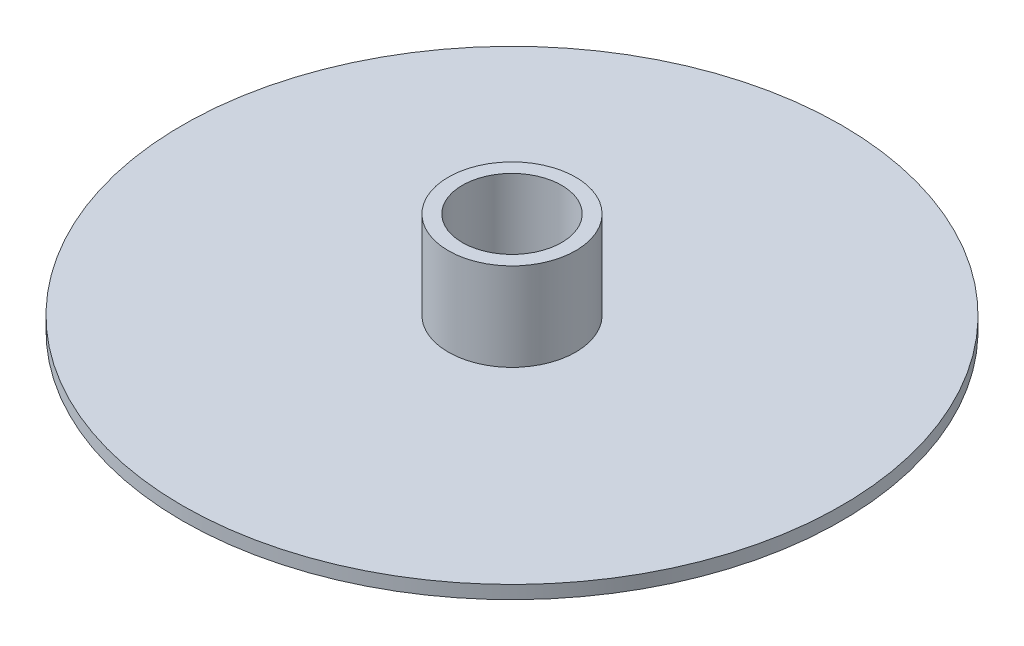
ISO-10303-21;
HEADER;
FILE_DESCRIPTION(('STEP AP214'),'2;1');
FILE_NAME('part.step','',(''),(''),'','','');
FILE_SCHEMA(('AUTOMOTIVE_DESIGN { 1 0 10303 214 1 1 1 1 }'));
ENDSEC;
DATA;
#1=APPLICATION_CONTEXT('core data for automotive mechanical design processes');
#2=APPLICATION_PROTOCOL_DEFINITION('international standard','automotive_design',2000,#1);
#3=PRODUCT_CONTEXT('',#1,'mechanical');
#4=PRODUCT('Part','Part','',(#3));
#5=PRODUCT_RELATED_PRODUCT_CATEGORY('part','',(#4));
#6=PRODUCT_DEFINITION_FORMATION('','',#4);
#7=PRODUCT_DEFINITION_CONTEXT('part definition',#1,'design');
#8=PRODUCT_DEFINITION('design','',#6,#7);
#9=PRODUCT_DEFINITION_SHAPE('','',#8);
#10=(LENGTH_UNIT() NAMED_UNIT(*) SI_UNIT(.MILLI.,.METRE.));
#11=(NAMED_UNIT(*) PLANE_ANGLE_UNIT() SI_UNIT($,.RADIAN.));
#12=(NAMED_UNIT(*) SI_UNIT($,.STERADIAN.) SOLID_ANGLE_UNIT());
#13=UNCERTAINTY_MEASURE_WITH_UNIT(LENGTH_MEASURE(1.E-05),#10,'distance_accuracy_value','');
#14=(GEOMETRIC_REPRESENTATION_CONTEXT(3) GLOBAL_UNCERTAINTY_ASSIGNED_CONTEXT((#13)) GLOBAL_UNIT_ASSIGNED_CONTEXT((#10,
#11,#12)) REPRESENTATION_CONTEXT('',''));
#15=CARTESIAN_POINT('',(0.,0.,0.));
#16=DIRECTION('',(0.,0.,1.));
#17=DIRECTION('',(1.,0.,0.));
#18=AXIS2_PLACEMENT_3D('',#15,#16,#17);
#19=CARTESIAN_POINT('',(0.,3.,0.));
#20=DIRECTION('',(0.,-1.,0.));
#21=DIRECTION('',(0.,0.,-1.));
#22=AXIS2_PLACEMENT_3D('',#19,#20,#21);
#23=CYLINDRICAL_SURFACE('',#22,75.);
#24=CARTESIAN_POINT('',(0.,3.,0.));
#25=DIRECTION('',(0.,1.,0.));
#26=DIRECTION('',(0.,0.,1.));
#27=AXIS2_PLACEMENT_3D('',#24,#25,#26);
#28=CIRCLE('',#27,75.);
#29=CARTESIAN_POINT('',(0.,3.,75.));
#30=VERTEX_POINT('',#29);
#31=EDGE_CURVE('E42',#30,#30,#28,.T.);
#32=ORIENTED_EDGE('',*,*,#31,.F.);
#33=EDGE_LOOP('',(#32));
#34=FACE_BOUND('',#33,.T.);
#35=CARTESIAN_POINT('',(0.,0.,0.));
#36=DIRECTION('',(0.,1.,0.));
#37=DIRECTION('',(0.,0.,1.));
#38=AXIS2_PLACEMENT_3D('',#35,#36,#37);
#39=CIRCLE('',#38,75.);
#40=CARTESIAN_POINT('',(0.,0.,75.));
#41=VERTEX_POINT('',#40);
#42=EDGE_CURVE('E46',#41,#41,#39,.T.);
#43=ORIENTED_EDGE('',*,*,#42,.T.);
#44=EDGE_LOOP('',(#43));
#45=FACE_BOUND('',#44,.T.);
#46=ADVANCED_FACE('F31',(#34,#45),#23,.T.);
#47=CARTESIAN_POINT('',(0.,3.,0.));
#48=DIRECTION('',(0.,1.,0.));
#49=DIRECTION('',(0.,0.,1.));
#50=AXIS2_PLACEMENT_3D('',#47,#48,#49);
#51=PLANE('',#50);
#52=CARTESIAN_POINT('',(0.,3.,0.));
#53=DIRECTION('',(0.,1.,0.));
#54=DIRECTION('',(0.,0.,1.));
#55=AXIS2_PLACEMENT_3D('',#52,#53,#54);
#56=CIRCLE('',#55,14.5);
#57=CARTESIAN_POINT('',(0.,3.,14.5));
#58=VERTEX_POINT('',#57);
#59=EDGE_CURVE('E52',#58,#58,#56,.T.);
#60=ORIENTED_EDGE('',*,*,#59,.F.);
#61=EDGE_LOOP('',(#60));
#62=FACE_BOUND('',#61,.T.);
#63=ORIENTED_EDGE('',*,*,#31,.T.);
#64=EDGE_LOOP('',(#63));
#65=FACE_BOUND('',#64,.T.);
#66=ADVANCED_FACE('F75',(#62,#65),#51,.T.);
#67=CARTESIAN_POINT('',(0.,0.,0.));
#68=DIRECTION('',(0.,1.,0.));
#69=DIRECTION('',(0.,0.,1.));
#70=AXIS2_PLACEMENT_3D('',#67,#68,#69);
#71=PLANE('',#70);
#72=ORIENTED_EDGE('',*,*,#42,.F.);
#73=EDGE_LOOP('',(#72));
#74=FACE_BOUND('',#73,.T.);
#75=ADVANCED_FACE('F66',(#74),#71,.F.);
#76=CARTESIAN_POINT('',(0.,23.,0.));
#77=DIRECTION('',(0.,1.,0.));
#78=DIRECTION('',(0.,0.,1.));
#79=AXIS2_PLACEMENT_3D('',#76,#77,#78);
#80=PLANE('',#79);
#81=CARTESIAN_POINT('',(0.,23.,0.));
#82=DIRECTION('',(0.,1.,0.));
#83=DIRECTION('',(0.,0.,1.));
#84=AXIS2_PLACEMENT_3D('',#81,#82,#83);
#85=CIRCLE('',#84,14.5);
#86=CARTESIAN_POINT('',(0.,23.,14.5));
#87=VERTEX_POINT('',#86);
#88=EDGE_CURVE('E50',#87,#87,#85,.T.);
#89=ORIENTED_EDGE('',*,*,#88,.T.);
#90=EDGE_LOOP('',(#89));
#91=FACE_BOUND('',#90,.T.);
#92=CARTESIAN_POINT('',(0.,23.,0.));
#93=DIRECTION('',(0.,1.,0.));
#94=DIRECTION('',(0.,0.,1.));
#95=AXIS2_PLACEMENT_3D('',#92,#93,#94);
#96=CIRCLE('',#95,11.3);
#97=CARTESIAN_POINT('',(0.,23.,11.3));
#98=VERTEX_POINT('',#97);
#99=EDGE_CURVE('E55',#98,#98,#96,.T.);
#100=ORIENTED_EDGE('',*,*,#99,.F.);
#101=EDGE_LOOP('',(#100));
#102=FACE_BOUND('',#101,.T.);
#103=ADVANCED_FACE('F63',(#91,#102),#80,.T.);
#104=CARTESIAN_POINT('',(0.,23.,0.));
#105=DIRECTION('',(0.,-1.,0.));
#106=DIRECTION('',(0.,0.,-1.));
#107=AXIS2_PLACEMENT_3D('',#104,#105,#106);
#108=CYLINDRICAL_SURFACE('',#107,14.5);
#109=ORIENTED_EDGE('',*,*,#88,.F.);
#110=EDGE_LOOP('',(#109));
#111=FACE_BOUND('',#110,.T.);
#112=ORIENTED_EDGE('',*,*,#59,.T.);
#113=EDGE_LOOP('',(#112));
#114=FACE_BOUND('',#113,.T.);
#115=ADVANCED_FACE('F65',(#111,#114),#108,.T.);
#116=CARTESIAN_POINT('',(0.,23.,0.));
#117=DIRECTION('',(0.,-1.,0.));
#118=DIRECTION('',(0.,0.,-1.));
#119=AXIS2_PLACEMENT_3D('',#116,#117,#118);
#120=CYLINDRICAL_SURFACE('',#119,11.3);
#121=CARTESIAN_POINT('',(0.,6.,0.));
#122=DIRECTION('',(0.,1.,0.));
#123=DIRECTION('',(0.,0.,1.));
#124=AXIS2_PLACEMENT_3D('',#121,#122,#123);
#125=CIRCLE('',#124,11.3);
#126=CARTESIAN_POINT('',(0.,6.,11.3));
#127=VERTEX_POINT('',#126);
#128=EDGE_CURVE('E38',#127,#127,#125,.F.);
#129=ORIENTED_EDGE('',*,*,#128,.T.);
#130=EDGE_LOOP('',(#129));
#131=FACE_BOUND('',#130,.T.);
#132=ORIENTED_EDGE('',*,*,#99,.T.);
#133=EDGE_LOOP('',(#132));
#134=FACE_BOUND('',#133,.T.);
#135=ADVANCED_FACE('F61',(#131,#134),#120,.F.);
#136=CARTESIAN_POINT('',(0.,3.,0.));
#137=DIRECTION('',(0.,1.,0.));
#138=DIRECTION('',(0.,0.,1.));
#139=AXIS2_PLACEMENT_3D('',#136,#137,#138);
#140=CIRCLE('',#139,8.3);
#141=CARTESIAN_POINT('',(0.,3.,8.3));
#142=VERTEX_POINT('',#141);
#143=EDGE_CURVE('E10',#142,#142,#140,.T.);
#144=ORIENTED_EDGE('',*,*,#143,.T.);
#145=EDGE_LOOP('',(#144));
#146=FACE_BOUND('',#145,.T.);
#147=ADVANCED_FACE('F86',(#146),#51,.T.);
#148=CARTESIAN_POINT('',(0.,6.,0.));
#149=DIRECTION('',(0.,1.,0.));
#150=DIRECTION('',(0.,0.,1.));
#151=AXIS2_PLACEMENT_3D('',#148,#149,#150);
#152=TOROIDAL_SURFACE('',#151,8.3,3.);
#153=ORIENTED_EDGE('',*,*,#143,.F.);
#154=EDGE_LOOP('',(#153));
#155=FACE_BOUND('',#154,.T.);
#156=ORIENTED_EDGE('',*,*,#128,.F.);
#157=EDGE_LOOP('',(#156));
#158=FACE_BOUND('',#157,.T.);
#159=ADVANCED_FACE('F33',(#155,#158),#152,.F.);
#160=CLOSED_SHELL('',(#46,#66,#75,#103,#115,#135,#147,#159));
#161=MANIFOLD_SOLID_BREP('B2',#160);
#162=ADVANCED_BREP_SHAPE_REPRESENTATION('',(#18,#161),#14);
#163=SHAPE_DEFINITION_REPRESENTATION(#9,#162);
ENDSEC;
END-ISO-10303-21;
